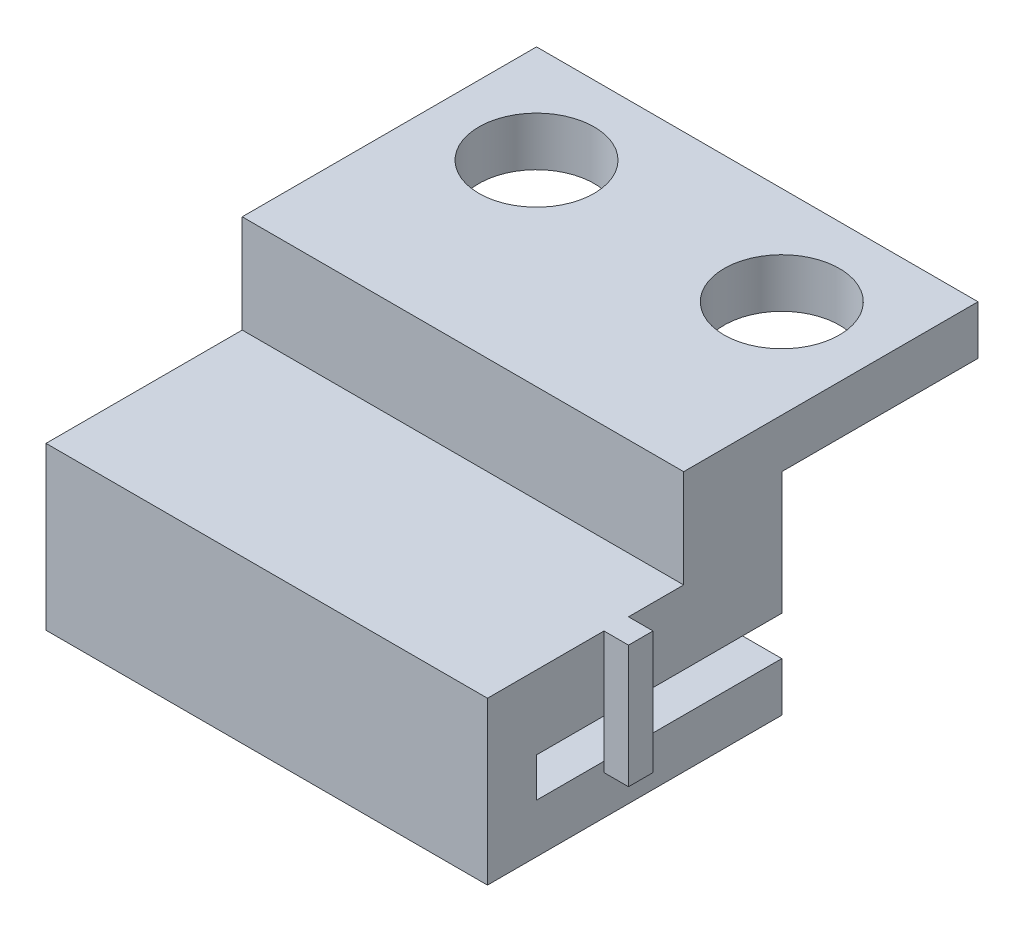
ISO-10303-21;
HEADER;
FILE_DESCRIPTION(('STEP AP214'),'2;1');
FILE_NAME('part.step','',(''),(''),'','','');
FILE_SCHEMA(('AUTOMOTIVE_DESIGN { 1 0 10303 214 1 1 1 1 }'));
ENDSEC;
DATA;
#1=APPLICATION_CONTEXT('core data for automotive mechanical design processes');
#2=APPLICATION_PROTOCOL_DEFINITION('international standard','automotive_design',2000,#1);
#3=PRODUCT_CONTEXT('',#1,'mechanical');
#4=PRODUCT('Part','Part','',(#3));
#5=PRODUCT_RELATED_PRODUCT_CATEGORY('part','',(#4));
#6=PRODUCT_DEFINITION_FORMATION('','',#4);
#7=PRODUCT_DEFINITION_CONTEXT('part definition',#1,'design');
#8=PRODUCT_DEFINITION('design','',#6,#7);
#9=PRODUCT_DEFINITION_SHAPE('','',#8);
#10=(LENGTH_UNIT() NAMED_UNIT(*) SI_UNIT(.MILLI.,.METRE.));
#11=(NAMED_UNIT(*) PLANE_ANGLE_UNIT() SI_UNIT($,.RADIAN.));
#12=(NAMED_UNIT(*) SI_UNIT($,.STERADIAN.) SOLID_ANGLE_UNIT());
#13=UNCERTAINTY_MEASURE_WITH_UNIT(LENGTH_MEASURE(1.E-05),#10,'distance_accuracy_value','');
#14=(GEOMETRIC_REPRESENTATION_CONTEXT(3) GLOBAL_UNCERTAINTY_ASSIGNED_CONTEXT((#13)) GLOBAL_UNIT_ASSIGNED_CONTEXT((#10,
#11,#12)) REPRESENTATION_CONTEXT('',''));
#15=CARTESIAN_POINT('',(0.,0.,0.));
#16=DIRECTION('',(0.,0.,1.));
#17=DIRECTION('',(1.,0.,0.));
#18=AXIS2_PLACEMENT_3D('',#15,#16,#17);
#19=CARTESIAN_POINT('',(9.,2.,-4.));
#20=DIRECTION('',(-1.,0.,0.));
#21=DIRECTION('',(0.,0.,1.));
#22=AXIS2_PLACEMENT_3D('',#19,#20,#21);
#23=PLANE('',#22);
#24=DIRECTION('',(0.,1.,0.));
#25=VECTOR('',#24,1.);
#26=CARTESIAN_POINT('',(9.,-7.,10.25));
#27=LINE('',#26,#25);
#28=CARTESIAN_POINT('',(9.,-5.,10.25));
#29=VERTEX_POINT('',#28);
#30=CARTESIAN_POINT('',(9.,-2.,10.25));
#31=VERTEX_POINT('',#30);
#32=EDGE_CURVE('E11',#29,#31,#27,.T.);
#33=ORIENTED_EDGE('',*,*,#32,.F.);
#34=DIRECTION('',(0.,0.,-1.));
#35=VECTOR('',#34,1.);
#36=CARTESIAN_POINT('',(9.,-5.,0.));
#37=LINE('',#36,#35);
#38=CARTESIAN_POINT('',(9.,-5.,4.));
#39=VERTEX_POINT('',#38);
#40=EDGE_CURVE('E232',#29,#39,#37,.T.);
#41=ORIENTED_EDGE('',*,*,#40,.T.);
#42=DIRECTION('',(0.,1.,0.));
#43=VECTOR('',#42,1.);
#44=CARTESIAN_POINT('',(9.,0.,4.));
#45=LINE('',#44,#43);
#46=CARTESIAN_POINT('',(9.,0.,4.));
#47=VERTEX_POINT('',#46);
#48=EDGE_CURVE('E236',#39,#47,#45,.T.);
#49=ORIENTED_EDGE('',*,*,#48,.T.);
#50=DIRECTION('',(0.,0.,-1.));
#51=VECTOR('',#50,1.);
#52=CARTESIAN_POINT('',(9.,0.,-4.));
#53=LINE('',#52,#51);
#54=CARTESIAN_POINT('',(9.,0.,-4.));
#55=VERTEX_POINT('',#54);
#56=EDGE_CURVE('E297',#47,#55,#53,.T.);
#57=ORIENTED_EDGE('',*,*,#56,.T.);
#58=DIRECTION('',(0.,-1.,0.));
#59=VECTOR('',#58,1.);
#60=CARTESIAN_POINT('',(9.,2.,-4.));
#61=LINE('',#60,#59);
#62=CARTESIAN_POINT('',(9.,2.,-4.));
#63=VERTEX_POINT('',#62);
#64=EDGE_CURVE('E302',#63,#55,#61,.T.);
#65=ORIENTED_EDGE('',*,*,#64,.F.);
#66=DIRECTION('',(0.,0.,-1.));
#67=VECTOR('',#66,1.);
#68=CARTESIAN_POINT('',(9.,2.,-4.));
#69=LINE('',#68,#67);
#70=CARTESIAN_POINT('',(9.,2.,8.));
#71=VERTEX_POINT('',#70);
#72=EDGE_CURVE('E290',#71,#63,#69,.T.);
#73=ORIENTED_EDGE('',*,*,#72,.F.);
#74=DIRECTION('',(0.,-1.,0.));
#75=VECTOR('',#74,1.);
#76=CARTESIAN_POINT('',(9.,2.,8.));
#77=LINE('',#76,#75);
#78=CARTESIAN_POINT('',(9.,-2.,8.));
#79=VERTEX_POINT('',#78);
#80=EDGE_CURVE('E304',#71,#79,#77,.T.);
#81=ORIENTED_EDGE('',*,*,#80,.T.);
#82=DIRECTION('',(0.,0.,1.));
#83=VECTOR('',#82,1.);
#84=CARTESIAN_POINT('',(9.,-2.,0.));
#85=LINE('',#84,#83);
#86=EDGE_CURVE('E241',#79,#31,#85,.T.);
#87=ORIENTED_EDGE('',*,*,#86,.T.);
#88=EDGE_LOOP('',(#33,#41,#49,#57,#65,#73,#81,#87));
#89=FACE_BOUND('',#88,.T.);
#90=ADVANCED_FACE('F35',(#89),#23,.F.);
#91=CARTESIAN_POINT('',(9.,-7.,10.25));
#92=VERTEX_POINT('',#91);
#93=CARTESIAN_POINT('',(9.,-6.6,10.25));
#94=VERTEX_POINT('',#93);
#95=EDGE_CURVE('E46',#92,#94,#27,.T.);
#96=ORIENTED_EDGE('',*,*,#95,.F.);
#97=DIRECTION('',(0.,0.,-1.));
#98=VECTOR('',#97,1.);
#99=CARTESIAN_POINT('',(9.,-7.,0.));
#100=LINE('',#99,#98);
#101=CARTESIAN_POINT('',(9.00000000000001,-7.,11.25));
#102=VERTEX_POINT('',#101);
#103=EDGE_CURVE('E169',#102,#92,#100,.T.);
#104=ORIENTED_EDGE('',*,*,#103,.F.);
#105=DIRECTION('',(0.,1.,0.));
#106=VECTOR('',#105,1.);
#107=CARTESIAN_POINT('',(9.00000000000001,-7.,11.25));
#108=LINE('',#107,#106);
#109=CARTESIAN_POINT('',(9.00000000000001,-6.6,11.25));
#110=VERTEX_POINT('',#109);
#111=EDGE_CURVE('E197',#102,#110,#108,.T.);
#112=ORIENTED_EDGE('',*,*,#111,.T.);
#113=DIRECTION('',(0.,0.,-1.));
#114=VECTOR('',#113,1.);
#115=CARTESIAN_POINT('',(9.,-6.6,0.));
#116=LINE('',#115,#114);
#117=CARTESIAN_POINT('',(9.00000000000001,-6.6,14.));
#118=VERTEX_POINT('',#117);
#119=EDGE_CURVE('E225',#118,#110,#116,.T.);
#120=ORIENTED_EDGE('',*,*,#119,.F.);
#121=DIRECTION('',(0.,1.,0.));
#122=VECTOR('',#121,1.);
#123=CARTESIAN_POINT('',(9.00000000000001,0.,14.));
#124=LINE('',#123,#122);
#125=CARTESIAN_POINT('',(9.00000000000001,-5.,14.));
#126=VERTEX_POINT('',#125);
#127=EDGE_CURVE('E228',#118,#126,#124,.T.);
#128=ORIENTED_EDGE('',*,*,#127,.T.);
#129=CARTESIAN_POINT('',(9.00000000000001,-5.,11.25));
#130=VERTEX_POINT('',#129);
#131=EDGE_CURVE('E233',#126,#130,#37,.T.);
#132=ORIENTED_EDGE('',*,*,#131,.T.);
#133=CARTESIAN_POINT('',(9.00000000000001,-2.,11.25));
#134=VERTEX_POINT('',#133);
#135=EDGE_CURVE('E44',#130,#134,#108,.T.);
#136=ORIENTED_EDGE('',*,*,#135,.T.);
#137=CARTESIAN_POINT('',(9.00000000000001,-2.,16.));
#138=VERTEX_POINT('',#137);
#139=EDGE_CURVE('E240',#134,#138,#85,.T.);
#140=ORIENTED_EDGE('',*,*,#139,.T.);
#141=DIRECTION('',(0.,-1.,0.));
#142=VECTOR('',#141,1.);
#143=CARTESIAN_POINT('',(9.00000000000001,0.,16.));
#144=LINE('',#143,#142);
#145=CARTESIAN_POINT('',(9.00000000000001,-8.6,16.));
#146=VERTEX_POINT('',#145);
#147=EDGE_CURVE('E244',#138,#146,#144,.T.);
#148=ORIENTED_EDGE('',*,*,#147,.T.);
#149=DIRECTION('',(0.,0.,1.));
#150=VECTOR('',#149,1.);
#151=CARTESIAN_POINT('',(9.,-8.6,0.));
#152=LINE('',#151,#150);
#153=CARTESIAN_POINT('',(9.,-8.6,4.));
#154=VERTEX_POINT('',#153);
#155=EDGE_CURVE('E196',#154,#146,#152,.T.);
#156=ORIENTED_EDGE('',*,*,#155,.F.);
#157=DIRECTION('',(0.,-1.,0.));
#158=VECTOR('',#157,1.);
#159=CARTESIAN_POINT('',(9.,0.,4.));
#160=LINE('',#159,#158);
#161=CARTESIAN_POINT('',(9.,-6.6,4.));
#162=VERTEX_POINT('',#161);
#163=EDGE_CURVE('E221',#162,#154,#160,.T.);
#164=ORIENTED_EDGE('',*,*,#163,.F.);
#165=EDGE_CURVE('E224',#94,#162,#116,.T.);
#166=ORIENTED_EDGE('',*,*,#165,.F.);
#167=EDGE_LOOP('',(#96,#104,#112,#120,#128,#132,#136,#140,#148,#156,#164,#166));
#168=FACE_BOUND('',#167,.T.);
#169=ADVANCED_FACE('F323',(#168),#23,.F.);
#170=CARTESIAN_POINT('',(0.,0.,0.));
#171=DIRECTION('',(0.,1.,0.));
#172=DIRECTION('',(0.,0.,1.));
#173=AXIS2_PLACEMENT_3D('',#170,#171,#172);
#174=PLANE('',#173);
#175=CARTESIAN_POINT('',(5.,0.,0.));
#176=DIRECTION('',(0.,1.,0.));
#177=DIRECTION('',(0.,0.,1.));
#178=AXIS2_PLACEMENT_3D('',#175,#176,#177);
#179=CIRCLE('',#178,2.35);
#180=CARTESIAN_POINT('',(5.,0.,2.35));
#181=VERTEX_POINT('',#180);
#182=EDGE_CURVE('E218',#181,#181,#179,.T.);
#183=ORIENTED_EDGE('',*,*,#182,.T.);
#184=EDGE_LOOP('',(#183));
#185=FACE_BOUND('',#184,.T.);
#186=CARTESIAN_POINT('',(-5.,0.,0.));
#187=DIRECTION('',(0.,1.,0.));
#188=DIRECTION('',(0.,0.,1.));
#189=AXIS2_PLACEMENT_3D('',#186,#187,#188);
#190=CIRCLE('',#189,2.35);
#191=CARTESIAN_POINT('',(-5.,0.,2.35));
#192=VERTEX_POINT('',#191);
#193=EDGE_CURVE('E275',#192,#192,#190,.T.);
#194=ORIENTED_EDGE('',*,*,#193,.T.);
#195=EDGE_LOOP('',(#194));
#196=FACE_BOUND('',#195,.T.);
#197=DIRECTION('',(1.,0.,0.));
#198=VECTOR('',#197,1.);
#199=CARTESIAN_POINT('',(-23.7634684271685,0.,4.));
#200=LINE('',#199,#198);
#201=CARTESIAN_POINT('',(-9.,0.,4.));
#202=VERTEX_POINT('',#201);
#203=EDGE_CURVE('E256',#202,#47,#200,.T.);
#204=ORIENTED_EDGE('',*,*,#203,.F.);
#205=DIRECTION('',(0.,0.,1.));
#206=VECTOR('',#205,1.);
#207=CARTESIAN_POINT('',(-9.,0.,-4.));
#208=LINE('',#207,#206);
#209=CARTESIAN_POINT('',(-9.,0.,-4.));
#210=VERTEX_POINT('',#209);
#211=EDGE_CURVE('E281',#210,#202,#208,.T.);
#212=ORIENTED_EDGE('',*,*,#211,.F.);
#213=DIRECTION('',(-1.,0.,0.));
#214=VECTOR('',#213,1.);
#215=CARTESIAN_POINT('',(-9.,0.,-4.));
#216=LINE('',#215,#214);
#217=EDGE_CURVE('E288',#55,#210,#216,.T.);
#218=ORIENTED_EDGE('',*,*,#217,.F.);
#219=ORIENTED_EDGE('',*,*,#56,.F.);
#220=EDGE_LOOP('',(#204,#212,#218,#219));
#221=FACE_BOUND('',#220,.T.);
#222=ADVANCED_FACE('F371',(#185,#196,#221),#174,.F.);
#223=CARTESIAN_POINT('',(0.,2.,0.));
#224=DIRECTION('',(0.,1.,0.));
#225=DIRECTION('',(0.,0.,1.));
#226=AXIS2_PLACEMENT_3D('',#223,#224,#225);
#227=PLANE('',#226);
#228=CARTESIAN_POINT('',(-5.,2.,0.));
#229=DIRECTION('',(0.,1.,0.));
#230=DIRECTION('',(0.,0.,1.));
#231=AXIS2_PLACEMENT_3D('',#228,#229,#230);
#232=CIRCLE('',#231,2.35);
#233=CARTESIAN_POINT('',(-5.,2.,2.35));
#234=VERTEX_POINT('',#233);
#235=EDGE_CURVE('E278',#234,#234,#232,.T.);
#236=ORIENTED_EDGE('',*,*,#235,.F.);
#237=EDGE_LOOP('',(#236));
#238=FACE_BOUND('',#237,.T.);
#239=DIRECTION('',(0.,0.,1.));
#240=VECTOR('',#239,1.);
#241=CARTESIAN_POINT('',(-9.,2.,-4.));
#242=LINE('',#241,#240);
#243=CARTESIAN_POINT('',(-9.,2.,-4.));
#244=VERTEX_POINT('',#243);
#245=CARTESIAN_POINT('',(-9.,2.,8.));
#246=VERTEX_POINT('',#245);
#247=EDGE_CURVE('E284',#244,#246,#242,.T.);
#248=ORIENTED_EDGE('',*,*,#247,.T.);
#249=DIRECTION('',(1.,0.,0.));
#250=VECTOR('',#249,1.);
#251=CARTESIAN_POINT('',(-9.,2.,8.));
#252=LINE('',#251,#250);
#253=EDGE_CURVE('E287',#246,#71,#252,.T.);
#254=ORIENTED_EDGE('',*,*,#253,.T.);
#255=ORIENTED_EDGE('',*,*,#72,.T.);
#256=DIRECTION('',(-1.,0.,0.));
#257=VECTOR('',#256,1.);
#258=CARTESIAN_POINT('',(-9.,2.,-4.));
#259=LINE('',#258,#257);
#260=EDGE_CURVE('E292',#63,#244,#259,.T.);
#261=ORIENTED_EDGE('',*,*,#260,.T.);
#262=EDGE_LOOP('',(#248,#254,#255,#261));
#263=FACE_BOUND('',#262,.T.);
#264=CARTESIAN_POINT('',(5.,2.,0.));
#265=DIRECTION('',(0.,1.,0.));
#266=DIRECTION('',(0.,0.,1.));
#267=AXIS2_PLACEMENT_3D('',#264,#265,#266);
#268=CIRCLE('',#267,2.35);
#269=CARTESIAN_POINT('',(5.,2.,2.35));
#270=VERTEX_POINT('',#269);
#271=EDGE_CURVE('E272',#270,#270,#268,.T.);
#272=ORIENTED_EDGE('',*,*,#271,.F.);
#273=EDGE_LOOP('',(#272));
#274=FACE_BOUND('',#273,.T.);
#275=ADVANCED_FACE('F365',(#238,#263,#274),#227,.T.);
#276=CARTESIAN_POINT('',(-9.,2.,-4.));
#277=DIRECTION('',(1.,0.,0.));
#278=DIRECTION('',(0.,0.,-1.));
#279=AXIS2_PLACEMENT_3D('',#276,#277,#278);
#280=PLANE('',#279);
#281=ORIENTED_EDGE('',*,*,#211,.T.);
#282=DIRECTION('',(0.,-1.,0.));
#283=VECTOR('',#282,1.);
#284=CARTESIAN_POINT('',(-9.,0.,4.));
#285=LINE('',#284,#283);
#286=CARTESIAN_POINT('',(-9.,-5.,4.));
#287=VERTEX_POINT('',#286);
#288=EDGE_CURVE('E208',#202,#287,#285,.T.);
#289=ORIENTED_EDGE('',*,*,#288,.T.);
#290=DIRECTION('',(0.,0.,1.));
#291=VECTOR('',#290,1.);
#292=CARTESIAN_POINT('',(-9.,-5.,0.));
#293=LINE('',#292,#291);
#294=CARTESIAN_POINT('',(-9.00000000000001,-5.,14.));
#295=VERTEX_POINT('',#294);
#296=EDGE_CURVE('E206',#287,#295,#293,.T.);
#297=ORIENTED_EDGE('',*,*,#296,.T.);
#298=DIRECTION('',(0.,-1.,0.));
#299=VECTOR('',#298,1.);
#300=CARTESIAN_POINT('',(-9.00000000000001,0.,14.));
#301=LINE('',#300,#299);
#302=CARTESIAN_POINT('',(-9.00000000000001,-6.6,14.));
#303=VERTEX_POINT('',#302);
#304=EDGE_CURVE('E203',#295,#303,#301,.T.);
#305=ORIENTED_EDGE('',*,*,#304,.T.);
#306=DIRECTION('',(0.,0.,1.));
#307=VECTOR('',#306,1.);
#308=CARTESIAN_POINT('',(-9.,-6.6,0.));
#309=LINE('',#308,#307);
#310=CARTESIAN_POINT('',(-9.,-6.6,4.));
#311=VERTEX_POINT('',#310);
#312=EDGE_CURVE('E200',#311,#303,#309,.T.);
#313=ORIENTED_EDGE('',*,*,#312,.F.);
#314=DIRECTION('',(0.,1.,0.));
#315=VECTOR('',#314,1.);
#316=CARTESIAN_POINT('',(-9.,0.,4.));
#317=LINE('',#316,#315);
#318=CARTESIAN_POINT('',(-9.,-8.6,4.));
#319=VERTEX_POINT('',#318);
#320=EDGE_CURVE('E204',#319,#311,#317,.T.);
#321=ORIENTED_EDGE('',*,*,#320,.F.);
#322=DIRECTION('',(0.,0.,-1.));
#323=VECTOR('',#322,1.);
#324=CARTESIAN_POINT('',(-9.,-8.6,0.));
#325=LINE('',#324,#323);
#326=CARTESIAN_POINT('',(-9.00000000000001,-8.6,16.));
#327=VERTEX_POINT('',#326);
#328=EDGE_CURVE('E215',#327,#319,#325,.T.);
#329=ORIENTED_EDGE('',*,*,#328,.F.);
#330=DIRECTION('',(0.,1.,0.));
#331=VECTOR('',#330,1.);
#332=CARTESIAN_POINT('',(-9.00000000000001,0.,16.));
#333=LINE('',#332,#331);
#334=CARTESIAN_POINT('',(-9.00000000000001,-2.,16.));
#335=VERTEX_POINT('',#334);
#336=EDGE_CURVE('E213',#327,#335,#333,.T.);
#337=ORIENTED_EDGE('',*,*,#336,.T.);
#338=DIRECTION('',(0.,0.,-1.));
#339=VECTOR('',#338,1.);
#340=CARTESIAN_POINT('',(-9.,-2.,0.));
#341=LINE('',#340,#339);
#342=CARTESIAN_POINT('',(-9.,-2.,8.));
#343=VERTEX_POINT('',#342);
#344=EDGE_CURVE('E210',#335,#343,#341,.T.);
#345=ORIENTED_EDGE('',*,*,#344,.T.);
#346=DIRECTION('',(0.,-1.,0.));
#347=VECTOR('',#346,1.);
#348=CARTESIAN_POINT('',(-9.,2.,8.));
#349=LINE('',#348,#347);
#350=EDGE_CURVE('E39',#246,#343,#349,.T.);
#351=ORIENTED_EDGE('',*,*,#350,.F.);
#352=ORIENTED_EDGE('',*,*,#247,.F.);
#353=DIRECTION('',(0.,-1.,0.));
#354=VECTOR('',#353,1.);
#355=CARTESIAN_POINT('',(-9.,2.,-4.));
#356=LINE('',#355,#354);
#357=EDGE_CURVE('E294',#244,#210,#356,.T.);
#358=ORIENTED_EDGE('',*,*,#357,.T.);
#359=EDGE_LOOP('',(#281,#289,#297,#305,#313,#321,#329,#337,#345,#351,#352,#358));
#360=FACE_BOUND('',#359,.T.);
#361=ADVANCED_FACE('F37',(#360),#280,.F.);
#362=CARTESIAN_POINT('',(-9.,2.,8.));
#363=DIRECTION('',(0.,0.,-1.));
#364=DIRECTION('',(-1.,0.,0.));
#365=AXIS2_PLACEMENT_3D('',#362,#363,#364);
#366=PLANE('',#365);
#367=ORIENTED_EDGE('',*,*,#350,.T.);
#368=DIRECTION('',(1.,0.,0.));
#369=VECTOR('',#368,1.);
#370=CARTESIAN_POINT('',(-23.7634684271685,-2.,8.));
#371=LINE('',#370,#369);
#372=EDGE_CURVE('E253',#343,#79,#371,.T.);
#373=ORIENTED_EDGE('',*,*,#372,.T.);
#374=ORIENTED_EDGE('',*,*,#80,.F.);
#375=ORIENTED_EDGE('',*,*,#253,.F.);
#376=EDGE_LOOP('',(#367,#373,#374,#375));
#377=FACE_BOUND('',#376,.T.);
#378=ADVANCED_FACE('F362',(#377),#366,.F.);
#379=CARTESIAN_POINT('',(-9.,2.,-4.));
#380=DIRECTION('',(0.,0.,1.));
#381=DIRECTION('',(1.,0.,0.));
#382=AXIS2_PLACEMENT_3D('',#379,#380,#381);
#383=PLANE('',#382);
#384=ORIENTED_EDGE('',*,*,#217,.T.);
#385=ORIENTED_EDGE('',*,*,#357,.F.);
#386=ORIENTED_EDGE('',*,*,#260,.F.);
#387=ORIENTED_EDGE('',*,*,#64,.T.);
#388=EDGE_LOOP('',(#384,#385,#386,#387));
#389=FACE_BOUND('',#388,.T.);
#390=ADVANCED_FACE('F372',(#389),#383,.F.);
#391=CARTESIAN_POINT('',(-5.,2.,0.));
#392=DIRECTION('',(0.,-1.,0.));
#393=DIRECTION('',(0.,0.,-1.));
#394=AXIS2_PLACEMENT_3D('',#391,#392,#393);
#395=CYLINDRICAL_SURFACE('',#394,2.35);
#396=ORIENTED_EDGE('',*,*,#235,.T.);
#397=EDGE_LOOP('',(#396));
#398=FACE_BOUND('',#397,.T.);
#399=ORIENTED_EDGE('',*,*,#193,.F.);
#400=EDGE_LOOP('',(#399));
#401=FACE_BOUND('',#400,.T.);
#402=ADVANCED_FACE('F374',(#398,#401),#395,.F.);
#403=CARTESIAN_POINT('',(5.,2.,0.));
#404=DIRECTION('',(0.,-1.,0.));
#405=DIRECTION('',(0.,0.,-1.));
#406=AXIS2_PLACEMENT_3D('',#403,#404,#405);
#407=CYLINDRICAL_SURFACE('',#406,2.35);
#408=ORIENTED_EDGE('',*,*,#271,.T.);
#409=EDGE_LOOP('',(#408));
#410=FACE_BOUND('',#409,.T.);
#411=ORIENTED_EDGE('',*,*,#182,.F.);
#412=EDGE_LOOP('',(#411));
#413=FACE_BOUND('',#412,.T.);
#414=ADVANCED_FACE('F380',(#410,#413),#407,.F.);
#415=CARTESIAN_POINT('',(-23.7634684271685,0.,4.));
#416=DIRECTION('',(0.,0.,1.));
#417=DIRECTION('',(1.,0.,0.));
#418=AXIS2_PLACEMENT_3D('',#415,#416,#417);
#419=PLANE('',#418);
#420=DIRECTION('',(1.,0.,0.));
#421=VECTOR('',#420,1.);
#422=CARTESIAN_POINT('',(-23.7634684271685,-8.6,4.));
#423=LINE('',#422,#421);
#424=EDGE_CURVE('E247',#319,#154,#423,.T.);
#425=ORIENTED_EDGE('',*,*,#424,.F.);
#426=ORIENTED_EDGE('',*,*,#320,.T.);
#427=DIRECTION('',(1.,0.,0.));
#428=VECTOR('',#427,1.);
#429=CARTESIAN_POINT('',(-23.7634684271685,-6.6,4.));
#430=LINE('',#429,#428);
#431=EDGE_CURVE('E266',#311,#162,#430,.T.);
#432=ORIENTED_EDGE('',*,*,#431,.T.);
#433=ORIENTED_EDGE('',*,*,#163,.T.);
#434=EDGE_LOOP('',(#425,#426,#432,#433));
#435=FACE_BOUND('',#434,.T.);
#436=ADVANCED_FACE('F356',(#435),#419,.F.);
#437=CARTESIAN_POINT('',(-23.7634684271685,-6.6,0.));
#438=DIRECTION('',(0.,-1.,0.));
#439=DIRECTION('',(0.,0.,-1.));
#440=AXIS2_PLACEMENT_3D('',#437,#438,#439);
#441=PLANE('',#440);
#442=ORIENTED_EDGE('',*,*,#431,.F.);
#443=ORIENTED_EDGE('',*,*,#312,.T.);
#444=DIRECTION('',(1.,0.,0.));
#445=VECTOR('',#444,1.);
#446=CARTESIAN_POINT('',(-23.7634684271685,-6.6,14.));
#447=LINE('',#446,#445);
#448=EDGE_CURVE('E264',#303,#118,#447,.T.);
#449=ORIENTED_EDGE('',*,*,#448,.T.);
#450=ORIENTED_EDGE('',*,*,#119,.T.);
#451=EDGE_CURVE('E229',#110,#94,#116,.T.);
#452=ORIENTED_EDGE('',*,*,#451,.T.);
#453=ORIENTED_EDGE('',*,*,#165,.T.);
#454=EDGE_LOOP('',(#442,#443,#449,#450,#452,#453));
#455=FACE_BOUND('',#454,.T.);
#456=ADVANCED_FACE('F360',(#455),#441,.F.);
#457=CARTESIAN_POINT('',(-23.7634684271685,0.,14.));
#458=DIRECTION('',(0.,0.,-1.));
#459=DIRECTION('',(-1.,0.,0.));
#460=AXIS2_PLACEMENT_3D('',#457,#458,#459);
#461=PLANE('',#460);
#462=ORIENTED_EDGE('',*,*,#304,.F.);
#463=DIRECTION('',(1.,0.,0.));
#464=VECTOR('',#463,1.);
#465=CARTESIAN_POINT('',(-23.7634684271685,-5.,14.));
#466=LINE('',#465,#464);
#467=EDGE_CURVE('E262',#295,#126,#466,.T.);
#468=ORIENTED_EDGE('',*,*,#467,.T.);
#469=ORIENTED_EDGE('',*,*,#127,.F.);
#470=ORIENTED_EDGE('',*,*,#448,.F.);
#471=EDGE_LOOP('',(#462,#468,#469,#470));
#472=FACE_BOUND('',#471,.T.);
#473=ADVANCED_FACE('F329',(#472),#461,.T.);
#474=CARTESIAN_POINT('',(-23.7634684271685,-5.,0.));
#475=DIRECTION('',(0.,-1.,0.));
#476=DIRECTION('',(0.,0.,-1.));
#477=AXIS2_PLACEMENT_3D('',#474,#475,#476);
#478=PLANE('',#477);
#479=ORIENTED_EDGE('',*,*,#296,.F.);
#480=DIRECTION('',(1.,0.,0.));
#481=VECTOR('',#480,1.);
#482=CARTESIAN_POINT('',(-23.7634684271685,-5.,4.));
#483=LINE('',#482,#481);
#484=EDGE_CURVE('E259',#287,#39,#483,.T.);
#485=ORIENTED_EDGE('',*,*,#484,.T.);
#486=ORIENTED_EDGE('',*,*,#40,.F.);
#487=EDGE_CURVE('E237',#130,#29,#37,.T.);
#488=ORIENTED_EDGE('',*,*,#487,.F.);
#489=ORIENTED_EDGE('',*,*,#131,.F.);
#490=ORIENTED_EDGE('',*,*,#467,.F.);
#491=EDGE_LOOP('',(#479,#485,#486,#488,#489,#490));
#492=FACE_BOUND('',#491,.T.);
#493=ADVANCED_FACE('F321',(#492),#478,.T.);
#494=CARTESIAN_POINT('',(-23.7634684271685,0.,4.));
#495=DIRECTION('',(0.,0.,-1.));
#496=DIRECTION('',(-1.,0.,0.));
#497=AXIS2_PLACEMENT_3D('',#494,#495,#496);
#498=PLANE('',#497);
#499=ORIENTED_EDGE('',*,*,#288,.F.);
#500=ORIENTED_EDGE('',*,*,#203,.T.);
#501=ORIENTED_EDGE('',*,*,#48,.F.);
#502=ORIENTED_EDGE('',*,*,#484,.F.);
#503=EDGE_LOOP('',(#499,#500,#501,#502));
#504=FACE_BOUND('',#503,.T.);
#505=ADVANCED_FACE('F336',(#504),#498,.T.);
#506=CARTESIAN_POINT('',(-23.7634684271685,-2.,0.));
#507=DIRECTION('',(0.,1.,0.));
#508=DIRECTION('',(0.,0.,1.));
#509=AXIS2_PLACEMENT_3D('',#506,#507,#508);
#510=PLANE('',#509);
#511=ORIENTED_EDGE('',*,*,#344,.F.);
#512=DIRECTION('',(1.,0.,0.));
#513=VECTOR('',#512,1.);
#514=CARTESIAN_POINT('',(-23.7634684271685,-2.,16.));
#515=LINE('',#514,#513);
#516=EDGE_CURVE('E250',#335,#138,#515,.T.);
#517=ORIENTED_EDGE('',*,*,#516,.T.);
#518=ORIENTED_EDGE('',*,*,#139,.F.);
#519=DIRECTION('',(1.,0.,0.));
#520=VECTOR('',#519,1.);
#521=CARTESIAN_POINT('',(0.,-2.,11.25));
#522=LINE('',#521,#520);
#523=CARTESIAN_POINT('',(10.,-2.,11.25));
#524=VERTEX_POINT('',#523);
#525=EDGE_CURVE('E60',#134,#524,#522,.T.);
#526=ORIENTED_EDGE('',*,*,#525,.T.);
#527=DIRECTION('',(0.,0.,1.));
#528=VECTOR('',#527,1.);
#529=CARTESIAN_POINT('',(10.,-2.,0.));
#530=LINE('',#529,#528);
#531=CARTESIAN_POINT('',(10.,-2.,10.25));
#532=VERTEX_POINT('',#531);
#533=EDGE_CURVE('E192',#532,#524,#530,.T.);
#534=ORIENTED_EDGE('',*,*,#533,.F.);
#535=DIRECTION('',(1.,0.,0.));
#536=VECTOR('',#535,1.);
#537=CARTESIAN_POINT('',(0.,-2.,10.25));
#538=LINE('',#537,#536);
#539=EDGE_CURVE('E178',#31,#532,#538,.T.);
#540=ORIENTED_EDGE('',*,*,#539,.F.);
#541=ORIENTED_EDGE('',*,*,#86,.F.);
#542=ORIENTED_EDGE('',*,*,#372,.F.);
#543=EDGE_LOOP('',(#511,#517,#518,#526,#534,#540,#541,#542));
#544=FACE_BOUND('',#543,.T.);
#545=ADVANCED_FACE('F342',(#544),#510,.T.);
#546=CARTESIAN_POINT('',(-23.7634684271685,0.,16.));
#547=DIRECTION('',(0.,0.,1.));
#548=DIRECTION('',(1.,0.,0.));
#549=AXIS2_PLACEMENT_3D('',#546,#547,#548);
#550=PLANE('',#549);
#551=ORIENTED_EDGE('',*,*,#336,.F.);
#552=DIRECTION('',(1.,0.,0.));
#553=VECTOR('',#552,1.);
#554=CARTESIAN_POINT('',(-23.7634684271685,-8.6,16.));
#555=LINE('',#554,#553);
#556=EDGE_CURVE('E248',#327,#146,#555,.T.);
#557=ORIENTED_EDGE('',*,*,#556,.T.);
#558=ORIENTED_EDGE('',*,*,#147,.F.);
#559=ORIENTED_EDGE('',*,*,#516,.F.);
#560=EDGE_LOOP('',(#551,#557,#558,#559));
#561=FACE_BOUND('',#560,.T.);
#562=ADVANCED_FACE('F350',(#561),#550,.T.);
#563=CARTESIAN_POINT('',(-23.7634684271685,-8.6,0.));
#564=DIRECTION('',(0.,1.,0.));
#565=DIRECTION('',(0.,0.,1.));
#566=AXIS2_PLACEMENT_3D('',#563,#564,#565);
#567=PLANE('',#566);
#568=ORIENTED_EDGE('',*,*,#556,.F.);
#569=ORIENTED_EDGE('',*,*,#328,.T.);
#570=ORIENTED_EDGE('',*,*,#424,.T.);
#571=ORIENTED_EDGE('',*,*,#155,.T.);
#572=EDGE_LOOP('',(#568,#569,#570,#571));
#573=FACE_BOUND('',#572,.T.);
#574=ADVANCED_FACE('F353',(#573),#567,.F.);
#575=CARTESIAN_POINT('',(9.,-7.,0.));
#576=DIRECTION('',(1.,0.,0.));
#577=DIRECTION('',(0.,0.,-1.));
#578=AXIS2_PLACEMENT_3D('',#575,#576,#577);
#579=PLANE('',#578);
#580=ORIENTED_EDGE('',*,*,#451,.F.);
#581=EDGE_CURVE('E54',#110,#130,#108,.T.);
#582=ORIENTED_EDGE('',*,*,#581,.T.);
#583=ORIENTED_EDGE('',*,*,#487,.T.);
#584=EDGE_CURVE('E47',#94,#29,#27,.T.);
#585=ORIENTED_EDGE('',*,*,#584,.F.);
#586=EDGE_LOOP('',(#580,#582,#583,#585));
#587=FACE_BOUND('',#586,.T.);
#588=ADVANCED_FACE('F314',(#587),#579,.F.);
#589=CARTESIAN_POINT('',(10.,-7.,0.));
#590=DIRECTION('',(-1.,0.,0.));
#591=DIRECTION('',(0.,-1.,0.));
#592=AXIS2_PLACEMENT_3D('',#589,#590,#591);
#593=PLANE('',#592);
#594=ORIENTED_EDGE('',*,*,#533,.T.);
#595=DIRECTION('',(0.,1.,0.));
#596=VECTOR('',#595,1.);
#597=CARTESIAN_POINT('',(10.,-7.,11.25));
#598=LINE('',#597,#596);
#599=CARTESIAN_POINT('',(10.,-7.,11.25));
#600=VERTEX_POINT('',#599);
#601=EDGE_CURVE('E185',#600,#524,#598,.T.);
#602=ORIENTED_EDGE('',*,*,#601,.F.);
#603=DIRECTION('',(0.,0.,1.));
#604=VECTOR('',#603,1.);
#605=CARTESIAN_POINT('',(10.,-7.,0.));
#606=LINE('',#605,#604);
#607=CARTESIAN_POINT('',(10.,-7.,10.25));
#608=VERTEX_POINT('',#607);
#609=EDGE_CURVE('E166',#608,#600,#606,.T.);
#610=ORIENTED_EDGE('',*,*,#609,.F.);
#611=DIRECTION('',(0.,1.,0.));
#612=VECTOR('',#611,1.);
#613=CARTESIAN_POINT('',(10.,-7.,10.25));
#614=LINE('',#613,#612);
#615=EDGE_CURVE('E175',#608,#532,#614,.T.);
#616=ORIENTED_EDGE('',*,*,#615,.T.);
#617=EDGE_LOOP('',(#594,#602,#610,#616));
#618=FACE_BOUND('',#617,.T.);
#619=ADVANCED_FACE('F184',(#618),#593,.F.);
#620=CARTESIAN_POINT('',(0.,-7.,11.25));
#621=DIRECTION('',(0.,0.,1.));
#622=DIRECTION('',(0.,-1.,0.));
#623=AXIS2_PLACEMENT_3D('',#620,#621,#622);
#624=PLANE('',#623);
#625=ORIENTED_EDGE('',*,*,#525,.F.);
#626=ORIENTED_EDGE('',*,*,#135,.F.);
#627=ORIENTED_EDGE('',*,*,#581,.F.);
#628=ORIENTED_EDGE('',*,*,#111,.F.);
#629=DIRECTION('',(1.,0.,0.));
#630=VECTOR('',#629,1.);
#631=CARTESIAN_POINT('',(0.,-7.,11.25));
#632=LINE('',#631,#630);
#633=EDGE_CURVE('E182',#102,#600,#632,.T.);
#634=ORIENTED_EDGE('',*,*,#633,.T.);
#635=ORIENTED_EDGE('',*,*,#601,.T.);
#636=EDGE_LOOP('',(#625,#626,#627,#628,#634,#635));
#637=FACE_BOUND('',#636,.T.);
#638=ADVANCED_FACE('F422',(#637),#624,.T.);
#639=CARTESIAN_POINT('',(0.,-7.,10.25));
#640=DIRECTION('',(0.,0.,1.));
#641=DIRECTION('',(0.,-1.,0.));
#642=AXIS2_PLACEMENT_3D('',#639,#640,#641);
#643=PLANE('',#642);
#644=ORIENTED_EDGE('',*,*,#539,.T.);
#645=ORIENTED_EDGE('',*,*,#615,.F.);
#646=DIRECTION('',(1.,0.,0.));
#647=VECTOR('',#646,1.);
#648=CARTESIAN_POINT('',(0.,-7.,10.25));
#649=LINE('',#648,#647);
#650=EDGE_CURVE('E161',#92,#608,#649,.T.);
#651=ORIENTED_EDGE('',*,*,#650,.F.);
#652=ORIENTED_EDGE('',*,*,#95,.T.);
#653=ORIENTED_EDGE('',*,*,#584,.T.);
#654=ORIENTED_EDGE('',*,*,#32,.T.);
#655=EDGE_LOOP('',(#644,#645,#651,#652,#653,#654));
#656=FACE_BOUND('',#655,.T.);
#657=ADVANCED_FACE('F176',(#656),#643,.F.);
#658=CARTESIAN_POINT('',(0.,-7.,0.));
#659=DIRECTION('',(0.,1.,0.));
#660=DIRECTION('',(0.,0.,1.));
#661=AXIS2_PLACEMENT_3D('',#658,#659,#660);
#662=PLANE('',#661);
#663=ORIENTED_EDGE('',*,*,#609,.T.);
#664=ORIENTED_EDGE('',*,*,#633,.F.);
#665=ORIENTED_EDGE('',*,*,#103,.T.);
#666=ORIENTED_EDGE('',*,*,#650,.T.);
#667=EDGE_LOOP('',(#663,#664,#665,#666));
#668=FACE_BOUND('',#667,.T.);
#669=ADVANCED_FACE('F163',(#668),#662,.F.);
#670=CLOSED_SHELL('',(#90,#169,#222,#275,#361,#378,#390,#402,#414,#436,#456,#473,#493,#505,#545,
#562,#574,#588,#619,#638,#657,#669));
#671=MANIFOLD_SOLID_BREP('B2',#670);
#672=ADVANCED_BREP_SHAPE_REPRESENTATION('',(#18,#671),#14);
#673=SHAPE_DEFINITION_REPRESENTATION(#9,#672);
ENDSEC;
END-ISO-10303-21;
